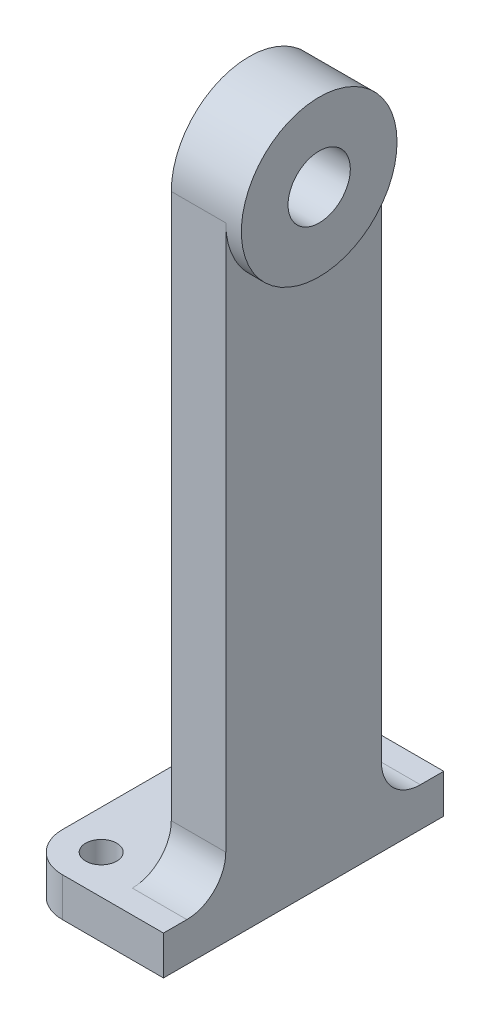
ISO-10303-21;
HEADER;
FILE_DESCRIPTION(('STEP AP214'),'2;1');
FILE_NAME('part.step','',(''),(''),'','','');
FILE_SCHEMA(('AUTOMOTIVE_DESIGN { 1 0 10303 214 1 1 1 1 }'));
ENDSEC;
DATA;
#1=APPLICATION_CONTEXT('core data for automotive mechanical design processes');
#2=APPLICATION_PROTOCOL_DEFINITION('international standard','automotive_design',2000,#1);
#3=PRODUCT_CONTEXT('',#1,'mechanical');
#4=PRODUCT('Part','Part','',(#3));
#5=PRODUCT_RELATED_PRODUCT_CATEGORY('part','',(#4));
#6=PRODUCT_DEFINITION_FORMATION('','',#4);
#7=PRODUCT_DEFINITION_CONTEXT('part definition',#1,'design');
#8=PRODUCT_DEFINITION('design','',#6,#7);
#9=PRODUCT_DEFINITION_SHAPE('','',#8);
#10=(LENGTH_UNIT() NAMED_UNIT(*) SI_UNIT(.MILLI.,.METRE.));
#11=(NAMED_UNIT(*) PLANE_ANGLE_UNIT() SI_UNIT($,.RADIAN.));
#12=(NAMED_UNIT(*) SI_UNIT($,.STERADIAN.) SOLID_ANGLE_UNIT());
#13=UNCERTAINTY_MEASURE_WITH_UNIT(LENGTH_MEASURE(1.E-05),#10,'distance_accuracy_value','');
#14=(GEOMETRIC_REPRESENTATION_CONTEXT(3) GLOBAL_UNCERTAINTY_ASSIGNED_CONTEXT((#13)) GLOBAL_UNIT_ASSIGNED_CONTEXT((#10,
#11,#12)) REPRESENTATION_CONTEXT('',''));
#15=CARTESIAN_POINT('',(0.,0.,0.));
#16=DIRECTION('',(0.,0.,1.));
#17=DIRECTION('',(1.,0.,0.));
#18=AXIS2_PLACEMENT_3D('',#15,#16,#17);
#19=CARTESIAN_POINT('',(-20.,25.,-65.));
#20=DIRECTION('',(0.,1.,0.));
#21=DIRECTION('',(0.,0.,1.));
#22=AXIS2_PLACEMENT_3D('',#19,#20,#21);
#23=PLANE('',#22);
#24=CARTESIAN_POINT('',(-20.,25.,-65.));
#25=DIRECTION('',(0.,1.,0.));
#26=DIRECTION('',(0.,0.,1.));
#27=AXIS2_PLACEMENT_3D('',#24,#25,#26);
#28=CIRCLE('',#27,10.);
#29=CARTESIAN_POINT('',(-20.,25.,-55.));
#30=VERTEX_POINT('',#29);
#31=EDGE_CURVE('E206',#30,#30,#28,.T.);
#32=ORIENTED_EDGE('',*,*,#31,.F.);
#33=EDGE_LOOP('',(#32));
#34=FACE_BOUND('',#33,.T.);
#35=CARTESIAN_POINT('',(-20.,25.,65.));
#36=DIRECTION('',(0.,1.,0.));
#37=DIRECTION('',(0.,0.,1.));
#38=AXIS2_PLACEMENT_3D('',#35,#36,#37);
#39=CIRCLE('',#38,10.);
#40=CARTESIAN_POINT('',(-20.,25.,75.));
#41=VERTEX_POINT('',#40);
#42=EDGE_CURVE('E198',#41,#41,#39,.T.);
#43=ORIENTED_EDGE('',*,*,#42,.F.);
#44=EDGE_LOOP('',(#43));
#45=FACE_BOUND('',#44,.T.);
#46=DIRECTION('',(0.,0.,-1.));
#47=VECTOR('',#46,1.);
#48=CARTESIAN_POINT('',(45.,25.,90.));
#49=LINE('',#48,#47);
#50=CARTESIAN_POINT('',(45.,25.,90.));
#51=VERTEX_POINT('',#50);
#52=CARTESIAN_POINT('',(45.,25.,75.));
#53=VERTEX_POINT('',#52);
#54=EDGE_CURVE('E214',#51,#53,#49,.T.);
#55=ORIENTED_EDGE('',*,*,#54,.T.);
#56=DIRECTION('',(1.,0.,0.));
#57=VECTOR('',#56,1.);
#58=CARTESIAN_POINT('',(9.99999999999999,25.,75.));
#59=LINE('',#58,#57);
#60=CARTESIAN_POINT('',(9.99999999999999,25.,75.));
#61=VERTEX_POINT('',#60);
#62=EDGE_CURVE('E62',#61,#53,#59,.T.);
#63=ORIENTED_EDGE('',*,*,#62,.F.);
#64=DIRECTION('',(0.,0.,1.));
#65=VECTOR('',#64,1.);
#66=CARTESIAN_POINT('',(9.99999999999999,25.,0.));
#67=LINE('',#66,#65);
#68=CARTESIAN_POINT('',(9.99999999999999,25.,-75.));
#69=VERTEX_POINT('',#68);
#70=EDGE_CURVE('E57',#69,#61,#67,.T.);
#71=ORIENTED_EDGE('',*,*,#70,.F.);
#72=DIRECTION('',(1.,0.,0.));
#73=VECTOR('',#72,1.);
#74=CARTESIAN_POINT('',(9.99999999999999,25.,-75.));
#75=LINE('',#74,#73);
#76=CARTESIAN_POINT('',(45.,25.,-75.));
#77=VERTEX_POINT('',#76);
#78=EDGE_CURVE('E164',#69,#77,#75,.T.);
#79=ORIENTED_EDGE('',*,*,#78,.T.);
#80=CARTESIAN_POINT('',(45.,25.,-90.));
#81=VERTEX_POINT('',#80);
#82=EDGE_CURVE('E218',#77,#81,#49,.T.);
#83=ORIENTED_EDGE('',*,*,#82,.T.);
#84=DIRECTION('',(-1.,0.,0.));
#85=VECTOR('',#84,1.);
#86=CARTESIAN_POINT('',(45.,25.,-90.));
#87=LINE('',#86,#85);
#88=CARTESIAN_POINT('',(-20.,25.,-90.));
#89=VERTEX_POINT('',#88);
#90=EDGE_CURVE('E217',#81,#89,#87,.T.);
#91=ORIENTED_EDGE('',*,*,#90,.T.);
#92=CARTESIAN_POINT('',(-20.,25.,-65.));
#93=DIRECTION('',(0.,1.,0.));
#94=DIRECTION('',(0.,0.,1.));
#95=AXIS2_PLACEMENT_3D('',#92,#93,#94);
#96=CIRCLE('',#95,25.);
#97=CARTESIAN_POINT('',(-45.,25.,-65.));
#98=VERTEX_POINT('',#97);
#99=EDGE_CURVE('E221',#89,#98,#96,.T.);
#100=ORIENTED_EDGE('',*,*,#99,.T.);
#101=DIRECTION('',(0.,0.,1.));
#102=VECTOR('',#101,1.);
#103=CARTESIAN_POINT('',(-45.,25.,65.));
#104=LINE('',#103,#102);
#105=CARTESIAN_POINT('',(-45.,25.,65.));
#106=VERTEX_POINT('',#105);
#107=EDGE_CURVE('E224',#98,#106,#104,.T.);
#108=ORIENTED_EDGE('',*,*,#107,.T.);
#109=CARTESIAN_POINT('',(-20.,25.,65.));
#110=DIRECTION('',(0.,1.,0.));
#111=DIRECTION('',(0.,0.,-1.));
#112=AXIS2_PLACEMENT_3D('',#109,#110,#111);
#113=CIRCLE('',#112,25.);
#114=CARTESIAN_POINT('',(-20.,25.,90.));
#115=VERTEX_POINT('',#114);
#116=EDGE_CURVE('E227',#106,#115,#113,.T.);
#117=ORIENTED_EDGE('',*,*,#116,.T.);
#118=DIRECTION('',(1.,0.,0.));
#119=VECTOR('',#118,1.);
#120=CARTESIAN_POINT('',(45.,25.,90.));
#121=LINE('',#120,#119);
#122=EDGE_CURVE('E230',#115,#51,#121,.T.);
#123=ORIENTED_EDGE('',*,*,#122,.T.);
#124=EDGE_LOOP('',(#55,#63,#71,#79,#83,#91,#100,#108,#117,#123));
#125=FACE_BOUND('',#124,.T.);
#126=ADVANCED_FACE('F41',(#34,#45,#125),#23,.T.);
#127=CARTESIAN_POINT('',(-20.,0.,-65.));
#128=DIRECTION('',(0.,1.,0.));
#129=DIRECTION('',(0.,0.,1.));
#130=AXIS2_PLACEMENT_3D('',#127,#128,#129);
#131=PLANE('',#130);
#132=DIRECTION('',(0.,0.,-1.));
#133=VECTOR('',#132,1.);
#134=CARTESIAN_POINT('',(45.,0.,90.));
#135=LINE('',#134,#133);
#136=CARTESIAN_POINT('',(45.,0.,90.));
#137=VERTEX_POINT('',#136);
#138=CARTESIAN_POINT('',(45.,0.,-90.));
#139=VERTEX_POINT('',#138);
#140=EDGE_CURVE('E210',#137,#139,#135,.T.);
#141=ORIENTED_EDGE('',*,*,#140,.F.);
#142=DIRECTION('',(1.,0.,0.));
#143=VECTOR('',#142,1.);
#144=CARTESIAN_POINT('',(45.,0.,90.));
#145=LINE('',#144,#143);
#146=CARTESIAN_POINT('',(-20.,0.,90.));
#147=VERTEX_POINT('',#146);
#148=EDGE_CURVE('E249',#147,#137,#145,.T.);
#149=ORIENTED_EDGE('',*,*,#148,.F.);
#150=CARTESIAN_POINT('',(-20.,0.,65.));
#151=DIRECTION('',(0.,1.,0.));
#152=DIRECTION('',(0.,0.,-1.));
#153=AXIS2_PLACEMENT_3D('',#150,#151,#152);
#154=CIRCLE('',#153,25.);
#155=CARTESIAN_POINT('',(-45.,0.,65.));
#156=VERTEX_POINT('',#155);
#157=EDGE_CURVE('E246',#156,#147,#154,.T.);
#158=ORIENTED_EDGE('',*,*,#157,.F.);
#159=DIRECTION('',(0.,0.,1.));
#160=VECTOR('',#159,1.);
#161=CARTESIAN_POINT('',(-45.,0.,65.));
#162=LINE('',#161,#160);
#163=CARTESIAN_POINT('',(-45.,0.,-65.));
#164=VERTEX_POINT('',#163);
#165=EDGE_CURVE('E243',#164,#156,#162,.T.);
#166=ORIENTED_EDGE('',*,*,#165,.F.);
#167=CARTESIAN_POINT('',(-20.,0.,-65.));
#168=DIRECTION('',(0.,1.,0.));
#169=DIRECTION('',(0.,0.,1.));
#170=AXIS2_PLACEMENT_3D('',#167,#168,#169);
#171=CIRCLE('',#170,25.);
#172=CARTESIAN_POINT('',(-20.,0.,-90.));
#173=VERTEX_POINT('',#172);
#174=EDGE_CURVE('E240',#173,#164,#171,.T.);
#175=ORIENTED_EDGE('',*,*,#174,.F.);
#176=DIRECTION('',(-1.,0.,0.));
#177=VECTOR('',#176,1.);
#178=CARTESIAN_POINT('',(45.,0.,-90.));
#179=LINE('',#178,#177);
#180=EDGE_CURVE('E237',#139,#173,#179,.T.);
#181=ORIENTED_EDGE('',*,*,#180,.F.);
#182=EDGE_LOOP('',(#141,#149,#158,#166,#175,#181));
#183=FACE_BOUND('',#182,.T.);
#184=CARTESIAN_POINT('',(-20.,0.,-65.));
#185=DIRECTION('',(0.,1.,0.));
#186=DIRECTION('',(0.,0.,1.));
#187=AXIS2_PLACEMENT_3D('',#184,#185,#186);
#188=CIRCLE('',#187,10.);
#189=CARTESIAN_POINT('',(-20.,0.,-55.));
#190=VERTEX_POINT('',#189);
#191=EDGE_CURVE('E202',#190,#190,#188,.T.);
#192=ORIENTED_EDGE('',*,*,#191,.T.);
#193=EDGE_LOOP('',(#192));
#194=FACE_BOUND('',#193,.T.);
#195=CARTESIAN_POINT('',(-20.,0.,65.));
#196=DIRECTION('',(0.,1.,0.));
#197=DIRECTION('',(0.,0.,1.));
#198=AXIS2_PLACEMENT_3D('',#195,#196,#197);
#199=CIRCLE('',#198,10.);
#200=CARTESIAN_POINT('',(-20.,0.,75.));
#201=VERTEX_POINT('',#200);
#202=EDGE_CURVE('E187',#201,#201,#199,.T.);
#203=ORIENTED_EDGE('',*,*,#202,.T.);
#204=EDGE_LOOP('',(#203));
#205=FACE_BOUND('',#204,.T.);
#206=ADVANCED_FACE('F279',(#183,#194,#205),#131,.F.);
#207=CARTESIAN_POINT('',(45.,25.,90.));
#208=DIRECTION('',(-1.,0.,0.));
#209=DIRECTION('',(0.,0.,1.));
#210=AXIS2_PLACEMENT_3D('',#207,#208,#209);
#211=PLANE('',#210);
#212=ORIENTED_EDGE('',*,*,#140,.T.);
#213=DIRECTION('',(0.,-1.,0.));
#214=VECTOR('',#213,1.);
#215=CARTESIAN_POINT('',(45.,25.,-90.));
#216=LINE('',#215,#214);
#217=EDGE_CURVE('E11',#81,#139,#216,.T.);
#218=ORIENTED_EDGE('',*,*,#217,.F.);
#219=ORIENTED_EDGE('',*,*,#82,.F.);
#220=CARTESIAN_POINT('',(45.,50.,-75.));
#221=DIRECTION('',(1.,0.,0.));
#222=DIRECTION('',(0.,0.,-1.));
#223=AXIS2_PLACEMENT_3D('',#220,#221,#222);
#224=CIRCLE('',#223,25.);
#225=CARTESIAN_POINT('',(45.,50.,-50.));
#226=VERTEX_POINT('',#225);
#227=EDGE_CURVE('E141',#226,#77,#224,.T.);
#228=ORIENTED_EDGE('',*,*,#227,.F.);
#229=DIRECTION('',(0.,-1.,0.));
#230=VECTOR('',#229,1.);
#231=CARTESIAN_POINT('',(45.,0.,-50.));
#232=LINE('',#231,#230);
#233=CARTESIAN_POINT('',(45.,400.,-50.));
#234=VERTEX_POINT('',#233);
#235=EDGE_CURVE('E173',#234,#226,#232,.T.);
#236=ORIENTED_EDGE('',*,*,#235,.F.);
#237=CARTESIAN_POINT('',(45.,400.,0.));
#238=DIRECTION('',(1.,0.,0.));
#239=DIRECTION('',(0.,0.,-1.));
#240=AXIS2_PLACEMENT_3D('',#237,#238,#239);
#241=CIRCLE('',#240,50.);
#242=CARTESIAN_POINT('',(45.,400.,50.));
#243=VERTEX_POINT('',#242);
#244=EDGE_CURVE('E176',#243,#234,#241,.T.);
#245=ORIENTED_EDGE('',*,*,#244,.F.);
#246=DIRECTION('',(0.,-1.,0.));
#247=VECTOR('',#246,1.);
#248=CARTESIAN_POINT('',(45.,0.,50.));
#249=LINE('',#248,#247);
#250=CARTESIAN_POINT('',(45.,50.,50.));
#251=VERTEX_POINT('',#250);
#252=EDGE_CURVE('E151',#243,#251,#249,.T.);
#253=ORIENTED_EDGE('',*,*,#252,.T.);
#254=CARTESIAN_POINT('',(45.,50.,75.));
#255=DIRECTION('',(1.,0.,0.));
#256=DIRECTION('',(0.,0.,-1.));
#257=AXIS2_PLACEMENT_3D('',#254,#255,#256);
#258=CIRCLE('',#257,25.);
#259=EDGE_CURVE('E181',#251,#53,#258,.F.);
#260=ORIENTED_EDGE('',*,*,#259,.T.);
#261=ORIENTED_EDGE('',*,*,#54,.F.);
#262=DIRECTION('',(0.,-1.,0.));
#263=VECTOR('',#262,1.);
#264=CARTESIAN_POINT('',(45.,25.,90.));
#265=LINE('',#264,#263);
#266=EDGE_CURVE('E233',#51,#137,#265,.T.);
#267=ORIENTED_EDGE('',*,*,#266,.T.);
#268=EDGE_LOOP('',(#212,#218,#219,#228,#236,#245,#253,#260,#261,#267));
#269=FACE_BOUND('',#268,.T.);
#270=ADVANCED_FACE('F43',(#269),#211,.F.);
#271=CARTESIAN_POINT('',(45.,25.,-90.));
#272=DIRECTION('',(0.,0.,1.));
#273=DIRECTION('',(1.,0.,0.));
#274=AXIS2_PLACEMENT_3D('',#271,#272,#273);
#275=PLANE('',#274);
#276=ORIENTED_EDGE('',*,*,#180,.T.);
#277=DIRECTION('',(0.,-1.,0.));
#278=VECTOR('',#277,1.);
#279=CARTESIAN_POINT('',(-20.,25.,-90.));
#280=LINE('',#279,#278);
#281=EDGE_CURVE('E50',#89,#173,#280,.T.);
#282=ORIENTED_EDGE('',*,*,#281,.F.);
#283=ORIENTED_EDGE('',*,*,#90,.F.);
#284=ORIENTED_EDGE('',*,*,#217,.T.);
#285=EDGE_LOOP('',(#276,#282,#283,#284));
#286=FACE_BOUND('',#285,.T.);
#287=ADVANCED_FACE('F294',(#286),#275,.F.);
#288=CARTESIAN_POINT('',(-20.,25.,-65.));
#289=DIRECTION('',(0.,-1.,0.));
#290=DIRECTION('',(0.,0.,-1.));
#291=AXIS2_PLACEMENT_3D('',#288,#289,#290);
#292=CYLINDRICAL_SURFACE('',#291,25.);
#293=ORIENTED_EDGE('',*,*,#174,.T.);
#294=DIRECTION('',(0.,-1.,0.));
#295=VECTOR('',#294,1.);
#296=CARTESIAN_POINT('',(-45.,25.,-65.));
#297=LINE('',#296,#295);
#298=EDGE_CURVE('E263',#98,#164,#297,.T.);
#299=ORIENTED_EDGE('',*,*,#298,.F.);
#300=ORIENTED_EDGE('',*,*,#99,.F.);
#301=ORIENTED_EDGE('',*,*,#281,.T.);
#302=EDGE_LOOP('',(#293,#299,#300,#301));
#303=FACE_BOUND('',#302,.T.);
#304=ADVANCED_FACE('F272',(#303),#292,.T.);
#305=CARTESIAN_POINT('',(-45.,25.,65.));
#306=DIRECTION('',(1.,0.,0.));
#307=DIRECTION('',(0.,0.,-1.));
#308=AXIS2_PLACEMENT_3D('',#305,#306,#307);
#309=PLANE('',#308);
#310=ORIENTED_EDGE('',*,*,#165,.T.);
#311=DIRECTION('',(0.,-1.,0.));
#312=VECTOR('',#311,1.);
#313=CARTESIAN_POINT('',(-45.,25.,65.));
#314=LINE('',#313,#312);
#315=EDGE_CURVE('E259',#106,#156,#314,.T.);
#316=ORIENTED_EDGE('',*,*,#315,.F.);
#317=ORIENTED_EDGE('',*,*,#107,.F.);
#318=ORIENTED_EDGE('',*,*,#298,.T.);
#319=EDGE_LOOP('',(#310,#316,#317,#318));
#320=FACE_BOUND('',#319,.T.);
#321=ADVANCED_FACE('F285',(#320),#309,.F.);
#322=CARTESIAN_POINT('',(-20.,25.,65.));
#323=DIRECTION('',(0.,-1.,0.));
#324=DIRECTION('',(0.,0.,-1.));
#325=AXIS2_PLACEMENT_3D('',#322,#323,#324);
#326=CYLINDRICAL_SURFACE('',#325,25.);
#327=ORIENTED_EDGE('',*,*,#157,.T.);
#328=DIRECTION('',(0.,-1.,0.));
#329=VECTOR('',#328,1.);
#330=CARTESIAN_POINT('',(-20.,25.,90.));
#331=LINE('',#330,#329);
#332=EDGE_CURVE('E255',#115,#147,#331,.T.);
#333=ORIENTED_EDGE('',*,*,#332,.F.);
#334=ORIENTED_EDGE('',*,*,#116,.F.);
#335=ORIENTED_EDGE('',*,*,#315,.T.);
#336=EDGE_LOOP('',(#327,#333,#334,#335));
#337=FACE_BOUND('',#336,.T.);
#338=ADVANCED_FACE('F289',(#337),#326,.T.);
#339=CARTESIAN_POINT('',(45.,25.,90.));
#340=DIRECTION('',(0.,0.,-1.));
#341=DIRECTION('',(-1.,0.,0.));
#342=AXIS2_PLACEMENT_3D('',#339,#340,#341);
#343=PLANE('',#342);
#344=ORIENTED_EDGE('',*,*,#148,.T.);
#345=ORIENTED_EDGE('',*,*,#266,.F.);
#346=ORIENTED_EDGE('',*,*,#122,.F.);
#347=ORIENTED_EDGE('',*,*,#332,.T.);
#348=EDGE_LOOP('',(#344,#345,#346,#347));
#349=FACE_BOUND('',#348,.T.);
#350=ADVANCED_FACE('F299',(#349),#343,.F.);
#351=CARTESIAN_POINT('',(-20.,25.,-65.));
#352=DIRECTION('',(0.,-1.,0.));
#353=DIRECTION('',(0.,0.,-1.));
#354=AXIS2_PLACEMENT_3D('',#351,#352,#353);
#355=CYLINDRICAL_SURFACE('',#354,10.);
#356=ORIENTED_EDGE('',*,*,#31,.T.);
#357=EDGE_LOOP('',(#356));
#358=FACE_BOUND('',#357,.T.);
#359=ORIENTED_EDGE('',*,*,#191,.F.);
#360=EDGE_LOOP('',(#359));
#361=FACE_BOUND('',#360,.T.);
#362=ADVANCED_FACE('F332',(#358,#361),#355,.F.);
#363=CARTESIAN_POINT('',(-20.,25.,65.));
#364=DIRECTION('',(0.,-1.,0.));
#365=DIRECTION('',(0.,0.,-1.));
#366=AXIS2_PLACEMENT_3D('',#363,#364,#365);
#367=CYLINDRICAL_SURFACE('',#366,10.);
#368=ORIENTED_EDGE('',*,*,#42,.T.);
#369=EDGE_LOOP('',(#368));
#370=FACE_BOUND('',#369,.T.);
#371=ORIENTED_EDGE('',*,*,#202,.F.);
#372=EDGE_LOOP('',(#371));
#373=FACE_BOUND('',#372,.T.);
#374=ADVANCED_FACE('F390',(#370,#373),#367,.F.);
#375=CARTESIAN_POINT('',(9.99999999999999,50.,75.));
#376=DIRECTION('',(1.,0.,0.));
#377=DIRECTION('',(0.,0.,-1.));
#378=AXIS2_PLACEMENT_3D('',#375,#376,#377);
#379=CYLINDRICAL_SURFACE('',#378,25.);
#380=ORIENTED_EDGE('',*,*,#259,.F.);
#381=DIRECTION('',(1.,0.,0.));
#382=VECTOR('',#381,1.);
#383=CARTESIAN_POINT('',(9.99999999999999,50.,50.));
#384=LINE('',#383,#382);
#385=CARTESIAN_POINT('',(9.99999999999999,50.,50.));
#386=VERTEX_POINT('',#385);
#387=EDGE_CURVE('E153',#386,#251,#384,.T.);
#388=ORIENTED_EDGE('',*,*,#387,.F.);
#389=CARTESIAN_POINT('',(9.99999999999999,50.,75.));
#390=DIRECTION('',(1.,0.,0.));
#391=DIRECTION('',(0.,0.,-1.));
#392=AXIS2_PLACEMENT_3D('',#389,#390,#391);
#393=CIRCLE('',#392,25.);
#394=EDGE_CURVE('E158',#386,#61,#393,.F.);
#395=ORIENTED_EDGE('',*,*,#394,.T.);
#396=ORIENTED_EDGE('',*,*,#62,.T.);
#397=EDGE_LOOP('',(#380,#388,#395,#396));
#398=FACE_BOUND('',#397,.T.);
#399=ADVANCED_FACE('F302',(#398),#379,.F.);
#400=CARTESIAN_POINT('',(9.99999999999999,0.,50.));
#401=DIRECTION('',(0.,0.,1.));
#402=DIRECTION('',(0.,-1.,0.));
#403=AXIS2_PLACEMENT_3D('',#400,#401,#402);
#404=PLANE('',#403);
#405=ORIENTED_EDGE('',*,*,#252,.F.);
#406=DIRECTION('',(1.,0.,0.));
#407=VECTOR('',#406,1.);
#408=CARTESIAN_POINT('',(9.99999999999999,400.,50.));
#409=LINE('',#408,#407);
#410=CARTESIAN_POINT('',(10.,400.,50.));
#411=VERTEX_POINT('',#410);
#412=EDGE_CURVE('E133',#411,#243,#409,.T.);
#413=ORIENTED_EDGE('',*,*,#412,.F.);
#414=DIRECTION('',(0.,-1.,0.));
#415=VECTOR('',#414,1.);
#416=CARTESIAN_POINT('',(9.99999999999999,0.,50.));
#417=LINE('',#416,#415);
#418=EDGE_CURVE('E148',#411,#386,#417,.T.);
#419=ORIENTED_EDGE('',*,*,#418,.T.);
#420=ORIENTED_EDGE('',*,*,#387,.T.);
#421=EDGE_LOOP('',(#405,#413,#419,#420));
#422=FACE_BOUND('',#421,.T.);
#423=ADVANCED_FACE('F147',(#422),#404,.T.);
#424=CARTESIAN_POINT('',(9.99999999999999,0.,-50.));
#425=DIRECTION('',(0.,0.,1.));
#426=DIRECTION('',(0.,-1.,0.));
#427=AXIS2_PLACEMENT_3D('',#424,#425,#426);
#428=PLANE('',#427);
#429=ORIENTED_EDGE('',*,*,#235,.T.);
#430=DIRECTION('',(1.,0.,0.));
#431=VECTOR('',#430,1.);
#432=CARTESIAN_POINT('',(9.99999999999999,50.,-50.));
#433=LINE('',#432,#431);
#434=CARTESIAN_POINT('',(9.99999999999999,50.,-50.));
#435=VERTEX_POINT('',#434);
#436=EDGE_CURVE('E192',#435,#226,#433,.T.);
#437=ORIENTED_EDGE('',*,*,#436,.F.);
#438=DIRECTION('',(0.,-1.,0.));
#439=VECTOR('',#438,1.);
#440=CARTESIAN_POINT('',(9.99999999999999,0.,-50.));
#441=LINE('',#440,#439);
#442=CARTESIAN_POINT('',(9.99999999999999,400.,-50.));
#443=VERTEX_POINT('',#442);
#444=EDGE_CURVE('E160',#443,#435,#441,.T.);
#445=ORIENTED_EDGE('',*,*,#444,.F.);
#446=DIRECTION('',(1.,0.,0.));
#447=VECTOR('',#446,1.);
#448=CARTESIAN_POINT('',(9.99999999999999,400.,-50.));
#449=LINE('',#448,#447);
#450=EDGE_CURVE('E136',#443,#234,#449,.T.);
#451=ORIENTED_EDGE('',*,*,#450,.T.);
#452=EDGE_LOOP('',(#429,#437,#445,#451));
#453=FACE_BOUND('',#452,.T.);
#454=ADVANCED_FACE('F305',(#453),#428,.F.);
#455=CARTESIAN_POINT('',(9.99999999999999,50.,-75.));
#456=DIRECTION('',(1.,0.,0.));
#457=DIRECTION('',(0.,0.,-1.));
#458=AXIS2_PLACEMENT_3D('',#455,#456,#457);
#459=CYLINDRICAL_SURFACE('',#458,25.);
#460=ORIENTED_EDGE('',*,*,#227,.T.);
#461=ORIENTED_EDGE('',*,*,#78,.F.);
#462=CARTESIAN_POINT('',(9.99999999999999,50.,-75.));
#463=DIRECTION('',(1.,0.,0.));
#464=DIRECTION('',(0.,0.,-1.));
#465=AXIS2_PLACEMENT_3D('',#462,#463,#464);
#466=CIRCLE('',#465,25.);
#467=EDGE_CURVE('E166',#435,#69,#466,.T.);
#468=ORIENTED_EDGE('',*,*,#467,.F.);
#469=ORIENTED_EDGE('',*,*,#436,.T.);
#470=EDGE_LOOP('',(#460,#461,#468,#469));
#471=FACE_BOUND('',#470,.T.);
#472=ADVANCED_FACE('F311',(#471),#459,.F.);
#473=CARTESIAN_POINT('',(9.99999999999999,0.,0.));
#474=DIRECTION('',(1.,0.,0.));
#475=DIRECTION('',(0.,0.,-1.));
#476=AXIS2_PLACEMENT_3D('',#473,#474,#475);
#477=PLANE('',#476);
#478=ORIENTED_EDGE('',*,*,#70,.T.);
#479=ORIENTED_EDGE('',*,*,#394,.F.);
#480=ORIENTED_EDGE('',*,*,#418,.F.);
#481=CARTESIAN_POINT('',(10.,400.,0.));
#482=DIRECTION('',(1.,0.,0.));
#483=DIRECTION('',(0.,0.,-1.));
#484=AXIS2_PLACEMENT_3D('',#481,#482,#483);
#485=CIRCLE('',#484,50.);
#486=EDGE_CURVE('E129',#411,#443,#485,.F.);
#487=ORIENTED_EDGE('',*,*,#486,.T.);
#488=ORIENTED_EDGE('',*,*,#444,.T.);
#489=ORIENTED_EDGE('',*,*,#467,.T.);
#490=EDGE_LOOP('',(#478,#479,#480,#487,#488,#489));
#491=FACE_BOUND('',#490,.T.);
#492=CARTESIAN_POINT('',(10.,400.,0.));
#493=DIRECTION('',(1.,0.,0.));
#494=DIRECTION('',(0.,0.,-1.));
#495=AXIS2_PLACEMENT_3D('',#492,#493,#494);
#496=CIRCLE('',#495,20.);
#497=CARTESIAN_POINT('',(10.,400.,-20.));
#498=VERTEX_POINT('',#497);
#499=EDGE_CURVE('E142',#498,#498,#496,.F.);
#500=ORIENTED_EDGE('',*,*,#499,.F.);
#501=EDGE_LOOP('',(#500));
#502=FACE_BOUND('',#501,.T.);
#503=ADVANCED_FACE('F155',(#491,#502),#477,.F.);
#504=CARTESIAN_POINT('',(-131.421356237309,400.,0.));
#505=DIRECTION('',(1.,0.,0.));
#506=DIRECTION('',(0.,0.,-1.));
#507=AXIS2_PLACEMENT_3D('',#504,#505,#506);
#508=CYLINDRICAL_SURFACE('',#507,20.);
#509=ORIENTED_EDGE('',*,*,#499,.T.);
#510=EDGE_LOOP('',(#509));
#511=FACE_BOUND('',#510,.T.);
#512=CARTESIAN_POINT('',(55.,400.,0.));
#513=DIRECTION('',(1.,0.,0.));
#514=DIRECTION('',(0.,0.,-1.));
#515=AXIS2_PLACEMENT_3D('',#512,#513,#514);
#516=CIRCLE('',#515,20.);
#517=CARTESIAN_POINT('',(55.,400.,-20.));
#518=VERTEX_POINT('',#517);
#519=EDGE_CURVE('E474',#518,#518,#516,.T.);
#520=ORIENTED_EDGE('',*,*,#519,.T.);
#521=EDGE_LOOP('',(#520));
#522=FACE_BOUND('',#521,.T.);
#523=ADVANCED_FACE('F318',(#511,#522),#508,.F.);
#524=CARTESIAN_POINT('',(-131.421356237309,400.,0.));
#525=DIRECTION('',(1.,0.,0.));
#526=DIRECTION('',(0.,0.,-1.));
#527=AXIS2_PLACEMENT_3D('',#524,#525,#526);
#528=CYLINDRICAL_SURFACE('',#527,50.);
#529=ORIENTED_EDGE('',*,*,#486,.F.);
#530=ORIENTED_EDGE('',*,*,#412,.T.);
#531=ORIENTED_EDGE('',*,*,#244,.T.);
#532=ORIENTED_EDGE('',*,*,#450,.F.);
#533=EDGE_LOOP('',(#529,#530,#531,#532));
#534=FACE_BOUND('',#533,.T.);
#535=CARTESIAN_POINT('',(55.,400.,0.));
#536=DIRECTION('',(1.,0.,0.));
#537=DIRECTION('',(0.,0.,-1.));
#538=AXIS2_PLACEMENT_3D('',#535,#536,#537);
#539=CIRCLE('',#538,50.);
#540=CARTESIAN_POINT('',(55.,400.,-50.));
#541=VERTEX_POINT('',#540);
#542=EDGE_CURVE('E477',#541,#541,#539,.T.);
#543=ORIENTED_EDGE('',*,*,#542,.F.);
#544=EDGE_LOOP('',(#543));
#545=FACE_BOUND('',#544,.T.);
#546=ADVANCED_FACE('F131',(#534,#545),#528,.T.);
#547=CARTESIAN_POINT('',(55.,0.,0.));
#548=DIRECTION('',(1.,0.,0.));
#549=DIRECTION('',(0.,0.,-1.));
#550=AXIS2_PLACEMENT_3D('',#547,#548,#549);
#551=PLANE('',#550);
#552=ORIENTED_EDGE('',*,*,#519,.F.);
#553=EDGE_LOOP('',(#552));
#554=FACE_BOUND('',#553,.T.);
#555=ORIENTED_EDGE('',*,*,#542,.T.);
#556=EDGE_LOOP('',(#555));
#557=FACE_BOUND('',#556,.T.);
#558=ADVANCED_FACE('F450',(#554,#557),#551,.T.);
#559=CLOSED_SHELL('',(#126,#206,#270,#287,#304,#321,#338,#350,#362,#374,#399,#423,#454,#472,
#503,#523,#546,#558));
#560=MANIFOLD_SOLID_BREP('B2',#559);
#561=ADVANCED_BREP_SHAPE_REPRESENTATION('',(#18,#560),#14);
#562=SHAPE_DEFINITION_REPRESENTATION(#9,#561);
ENDSEC;
END-ISO-10303-21;
